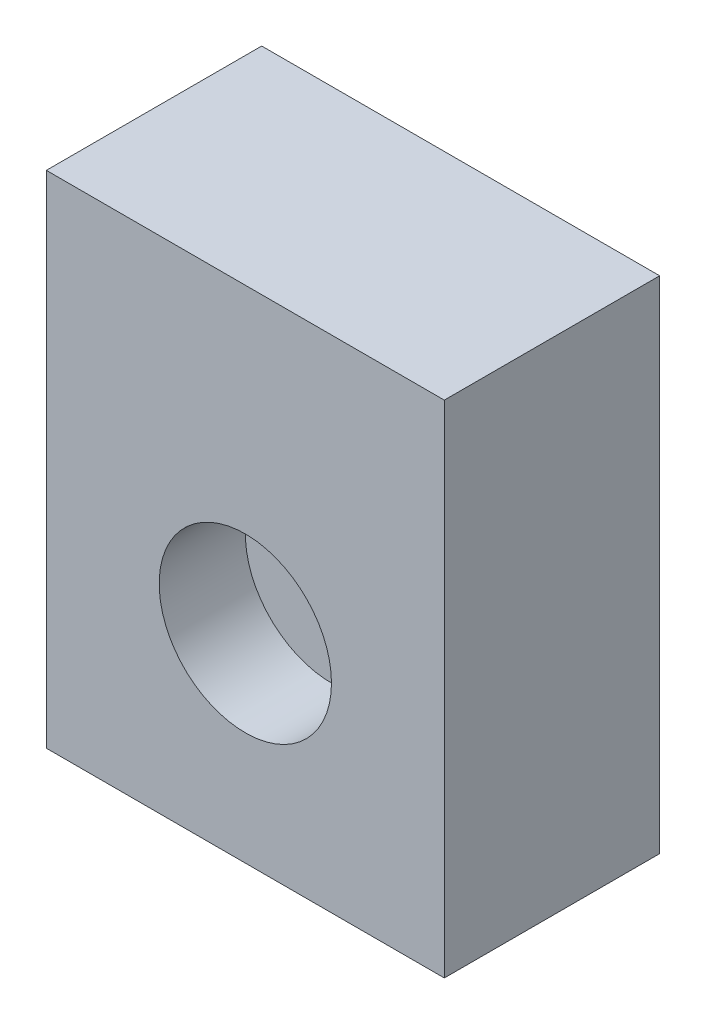
ISO-10303-21;
HEADER;
FILE_DESCRIPTION(('STEP AP214'),'2;1');
FILE_NAME('part.step','',(''),(''),'','','');
FILE_SCHEMA(('AUTOMOTIVE_DESIGN { 1 0 10303 214 1 1 1 1 }'));
ENDSEC;
DATA;
#1=APPLICATION_CONTEXT('core data for automotive mechanical design processes');
#2=APPLICATION_PROTOCOL_DEFINITION('international standard','automotive_design',2000,#1);
#3=PRODUCT_CONTEXT('',#1,'mechanical');
#4=PRODUCT('Part','Part','',(#3));
#5=PRODUCT_RELATED_PRODUCT_CATEGORY('part','',(#4));
#6=PRODUCT_DEFINITION_FORMATION('','',#4);
#7=PRODUCT_DEFINITION_CONTEXT('part definition',#1,'design');
#8=PRODUCT_DEFINITION('design','',#6,#7);
#9=PRODUCT_DEFINITION_SHAPE('','',#8);
#10=(LENGTH_UNIT() NAMED_UNIT(*) SI_UNIT(.MILLI.,.METRE.));
#11=(NAMED_UNIT(*) PLANE_ANGLE_UNIT() SI_UNIT($,.RADIAN.));
#12=(NAMED_UNIT(*) SI_UNIT($,.STERADIAN.) SOLID_ANGLE_UNIT());
#13=UNCERTAINTY_MEASURE_WITH_UNIT(LENGTH_MEASURE(1.E-05),#10,'distance_accuracy_value','');
#14=(GEOMETRIC_REPRESENTATION_CONTEXT(3) GLOBAL_UNCERTAINTY_ASSIGNED_CONTEXT((#13)) GLOBAL_UNIT_ASSIGNED_CONTEXT((#10,
#11,#12)) REPRESENTATION_CONTEXT('',''));
#15=CARTESIAN_POINT('',(0.,0.,0.));
#16=DIRECTION('',(0.,0.,1.));
#17=DIRECTION('',(1.,0.,0.));
#18=AXIS2_PLACEMENT_3D('',#15,#16,#17);
#19=CARTESIAN_POINT('',(4.62000000000005,5.80999999999998,5.));
#20=DIRECTION('',(-1.,0.,0.));
#21=DIRECTION('',(0.,0.,1.));
#22=AXIS2_PLACEMENT_3D('',#19,#20,#21);
#23=PLANE('',#22);
#24=DIRECTION('',(0.,1.,0.));
#25=VECTOR('',#24,1.);
#26=CARTESIAN_POINT('',(4.62000000000005,5.80999999999998,0.));
#27=LINE('',#26,#25);
#28=CARTESIAN_POINT('',(4.62000000000005,-5.80999999999998,0.));
#29=VERTEX_POINT('',#28);
#30=CARTESIAN_POINT('',(4.62000000000005,5.80999999999998,0.));
#31=VERTEX_POINT('',#30);
#32=EDGE_CURVE('E113',#29,#31,#27,.T.);
#33=ORIENTED_EDGE('',*,*,#32,.T.);
#34=DIRECTION('',(0.,0.,-1.));
#35=VECTOR('',#34,1.);
#36=CARTESIAN_POINT('',(4.62000000000005,5.80999999999998,5.));
#37=LINE('',#36,#35);
#38=CARTESIAN_POINT('',(4.62000000000005,5.80999999999998,5.));
#39=VERTEX_POINT('',#38);
#40=EDGE_CURVE('E11',#39,#31,#37,.T.);
#41=ORIENTED_EDGE('',*,*,#40,.F.);
#42=DIRECTION('',(0.,1.,0.));
#43=VECTOR('',#42,1.);
#44=CARTESIAN_POINT('',(4.62000000000005,5.80999999999998,5.));
#45=LINE('',#44,#43);
#46=CARTESIAN_POINT('',(4.62000000000005,-5.80999999999998,5.));
#47=VERTEX_POINT('',#46);
#48=EDGE_CURVE('E97',#47,#39,#45,.T.);
#49=ORIENTED_EDGE('',*,*,#48,.F.);
#50=DIRECTION('',(0.,0.,-1.));
#51=VECTOR('',#50,1.);
#52=CARTESIAN_POINT('',(4.62000000000005,-5.80999999999998,5.));
#53=LINE('',#52,#51);
#54=EDGE_CURVE('E109',#47,#29,#53,.T.);
#55=ORIENTED_EDGE('',*,*,#54,.T.);
#56=EDGE_LOOP('',(#33,#41,#49,#55));
#57=FACE_BOUND('',#56,.T.);
#58=ADVANCED_FACE('F45',(#57),#23,.F.);
#59=CARTESIAN_POINT('',(-4.61999999999993,5.80999999999998,5.));
#60=DIRECTION('',(0.,-1.,0.));
#61=DIRECTION('',(0.,0.,-1.));
#62=AXIS2_PLACEMENT_3D('',#59,#60,#61);
#63=PLANE('',#62);
#64=DIRECTION('',(-1.,0.,0.));
#65=VECTOR('',#64,1.);
#66=CARTESIAN_POINT('',(-4.61999999999993,5.80999999999998,0.));
#67=LINE('',#66,#65);
#68=CARTESIAN_POINT('',(-4.61999999999993,5.80999999999998,0.));
#69=VERTEX_POINT('',#68);
#70=EDGE_CURVE('E102',#31,#69,#67,.T.);
#71=ORIENTED_EDGE('',*,*,#70,.T.);
#72=DIRECTION('',(0.,0.,-1.));
#73=VECTOR('',#72,1.);
#74=CARTESIAN_POINT('',(-4.61999999999993,5.80999999999998,5.));
#75=LINE('',#74,#73);
#76=CARTESIAN_POINT('',(-4.61999999999993,5.80999999999998,5.));
#77=VERTEX_POINT('',#76);
#78=EDGE_CURVE('E54',#77,#69,#75,.T.);
#79=ORIENTED_EDGE('',*,*,#78,.F.);
#80=DIRECTION('',(-1.,0.,0.));
#81=VECTOR('',#80,1.);
#82=CARTESIAN_POINT('',(-4.61999999999993,5.80999999999998,5.));
#83=LINE('',#82,#81);
#84=EDGE_CURVE('E92',#39,#77,#83,.T.);
#85=ORIENTED_EDGE('',*,*,#84,.F.);
#86=ORIENTED_EDGE('',*,*,#40,.T.);
#87=EDGE_LOOP('',(#71,#79,#85,#86));
#88=FACE_BOUND('',#87,.T.);
#89=ADVANCED_FACE('F101',(#88),#63,.F.);
#90=CARTESIAN_POINT('',(-4.61999999999993,5.80999999999998,5.));
#91=DIRECTION('',(1.,0.,0.));
#92=DIRECTION('',(0.,1.,0.));
#93=AXIS2_PLACEMENT_3D('',#90,#91,#92);
#94=PLANE('',#93);
#95=DIRECTION('',(0.,-1.,0.));
#96=VECTOR('',#95,1.);
#97=CARTESIAN_POINT('',(-4.61999999999993,5.80999999999998,0.));
#98=LINE('',#97,#96);
#99=CARTESIAN_POINT('',(-4.61999999999994,-5.80999999999998,0.));
#100=VERTEX_POINT('',#99);
#101=EDGE_CURVE('E79',#69,#100,#98,.T.);
#102=ORIENTED_EDGE('',*,*,#101,.T.);
#103=DIRECTION('',(0.,0.,-1.));
#104=VECTOR('',#103,1.);
#105=CARTESIAN_POINT('',(-4.61999999999994,-5.80999999999998,5.));
#106=LINE('',#105,#104);
#107=CARTESIAN_POINT('',(-4.61999999999994,-5.80999999999998,5.));
#108=VERTEX_POINT('',#107);
#109=EDGE_CURVE('E104',#108,#100,#106,.T.);
#110=ORIENTED_EDGE('',*,*,#109,.F.);
#111=DIRECTION('',(0.,-1.,0.));
#112=VECTOR('',#111,1.);
#113=CARTESIAN_POINT('',(-4.61999999999993,5.80999999999998,5.));
#114=LINE('',#113,#112);
#115=EDGE_CURVE('E95',#77,#108,#114,.T.);
#116=ORIENTED_EDGE('',*,*,#115,.F.);
#117=ORIENTED_EDGE('',*,*,#78,.T.);
#118=EDGE_LOOP('',(#102,#110,#116,#117));
#119=FACE_BOUND('',#118,.T.);
#120=ADVANCED_FACE('F105',(#119),#94,.F.);
#121=CARTESIAN_POINT('',(-4.61999999999994,-5.80999999999998,5.));
#122=DIRECTION('',(0.,1.,0.));
#123=DIRECTION('',(0.,0.,1.));
#124=AXIS2_PLACEMENT_3D('',#121,#122,#123);
#125=PLANE('',#124);
#126=DIRECTION('',(1.,0.,0.));
#127=VECTOR('',#126,1.);
#128=CARTESIAN_POINT('',(-4.61999999999994,-5.80999999999998,0.));
#129=LINE('',#128,#127);
#130=EDGE_CURVE('E85',#100,#29,#129,.T.);
#131=ORIENTED_EDGE('',*,*,#130,.T.);
#132=ORIENTED_EDGE('',*,*,#54,.F.);
#133=DIRECTION('',(1.,0.,0.));
#134=VECTOR('',#133,1.);
#135=CARTESIAN_POINT('',(-4.61999999999994,-5.80999999999998,5.));
#136=LINE('',#135,#134);
#137=EDGE_CURVE('E62',#108,#47,#136,.T.);
#138=ORIENTED_EDGE('',*,*,#137,.F.);
#139=ORIENTED_EDGE('',*,*,#109,.T.);
#140=EDGE_LOOP('',(#131,#132,#138,#139));
#141=FACE_BOUND('',#140,.T.);
#142=ADVANCED_FACE('F127',(#141),#125,.F.);
#143=CARTESIAN_POINT('',(0.,0.,5.));
#144=DIRECTION('',(0.,0.,1.));
#145=DIRECTION('',(1.,0.,0.));
#146=AXIS2_PLACEMENT_3D('',#143,#144,#145);
#147=PLANE('',#146);
#148=CARTESIAN_POINT('',(0.,-1.18999999999998,5.));
#149=DIRECTION('',(0.,0.,1.));
#150=DIRECTION('',(1.,0.,0.));
#151=AXIS2_PLACEMENT_3D('',#148,#149,#150);
#152=CIRCLE('',#151,2.);
#153=CARTESIAN_POINT('',(2.,-1.18999999999998,5.));
#154=VERTEX_POINT('',#153);
#155=EDGE_CURVE('E134',#154,#154,#152,.T.);
#156=ORIENTED_EDGE('',*,*,#155,.F.);
#157=EDGE_LOOP('',(#156));
#158=FACE_BOUND('',#157,.T.);
#159=ORIENTED_EDGE('',*,*,#48,.T.);
#160=ORIENTED_EDGE('',*,*,#84,.T.);
#161=ORIENTED_EDGE('',*,*,#115,.T.);
#162=ORIENTED_EDGE('',*,*,#137,.T.);
#163=EDGE_LOOP('',(#159,#160,#161,#162));
#164=FACE_BOUND('',#163,.T.);
#165=ADVANCED_FACE('F93',(#158,#164),#147,.T.);
#166=CARTESIAN_POINT('',(0.,0.,0.));
#167=DIRECTION('',(0.,0.,1.));
#168=DIRECTION('',(1.,0.,0.));
#169=AXIS2_PLACEMENT_3D('',#166,#167,#168);
#170=PLANE('',#169);
#171=ORIENTED_EDGE('',*,*,#32,.F.);
#172=ORIENTED_EDGE('',*,*,#130,.F.);
#173=ORIENTED_EDGE('',*,*,#101,.F.);
#174=ORIENTED_EDGE('',*,*,#70,.F.);
#175=EDGE_LOOP('',(#171,#172,#173,#174));
#176=FACE_BOUND('',#175,.T.);
#177=ADVANCED_FACE('F130',(#176),#170,.F.);
#178=CARTESIAN_POINT('',(0.,-1.18999999999998,3.));
#179=DIRECTION('',(0.,0.,1.));
#180=DIRECTION('',(1.,0.,0.));
#181=AXIS2_PLACEMENT_3D('',#178,#179,#180);
#182=CYLINDRICAL_SURFACE('',#181,2.);
#183=CARTESIAN_POINT('',(0.,-1.18999999999998,3.));
#184=DIRECTION('',(0.,0.,1.));
#185=DIRECTION('',(1.,0.,0.));
#186=AXIS2_PLACEMENT_3D('',#183,#184,#185);
#187=CIRCLE('',#186,2.);
#188=CARTESIAN_POINT('',(2.,-1.18999999999998,3.));
#189=VERTEX_POINT('',#188);
#190=EDGE_CURVE('E117',#189,#189,#187,.T.);
#191=ORIENTED_EDGE('',*,*,#190,.F.);
#192=EDGE_LOOP('',(#191));
#193=FACE_BOUND('',#192,.T.);
#194=ORIENTED_EDGE('',*,*,#155,.T.);
#195=EDGE_LOOP('',(#194));
#196=FACE_BOUND('',#195,.T.);
#197=ADVANCED_FACE('F144',(#193,#196),#182,.F.);
#198=CARTESIAN_POINT('',(0.,-1.18999999999998,3.));
#199=DIRECTION('',(0.,0.,1.));
#200=DIRECTION('',(1.,0.,0.));
#201=AXIS2_PLACEMENT_3D('',#198,#199,#200);
#202=PLANE('',#201);
#203=ORIENTED_EDGE('',*,*,#190,.T.);
#204=EDGE_LOOP('',(#203));
#205=FACE_BOUND('',#204,.T.);
#206=ADVANCED_FACE('F142',(#205),#202,.T.);
#207=CLOSED_SHELL('',(#58,#89,#120,#142,#165,#177,#197,#206));
#208=MANIFOLD_SOLID_BREP('B2',#207);
#209=ADVANCED_BREP_SHAPE_REPRESENTATION('',(#18,#208),#14);
#210=SHAPE_DEFINITION_REPRESENTATION(#9,#209);
ENDSEC;
END-ISO-10303-21;
